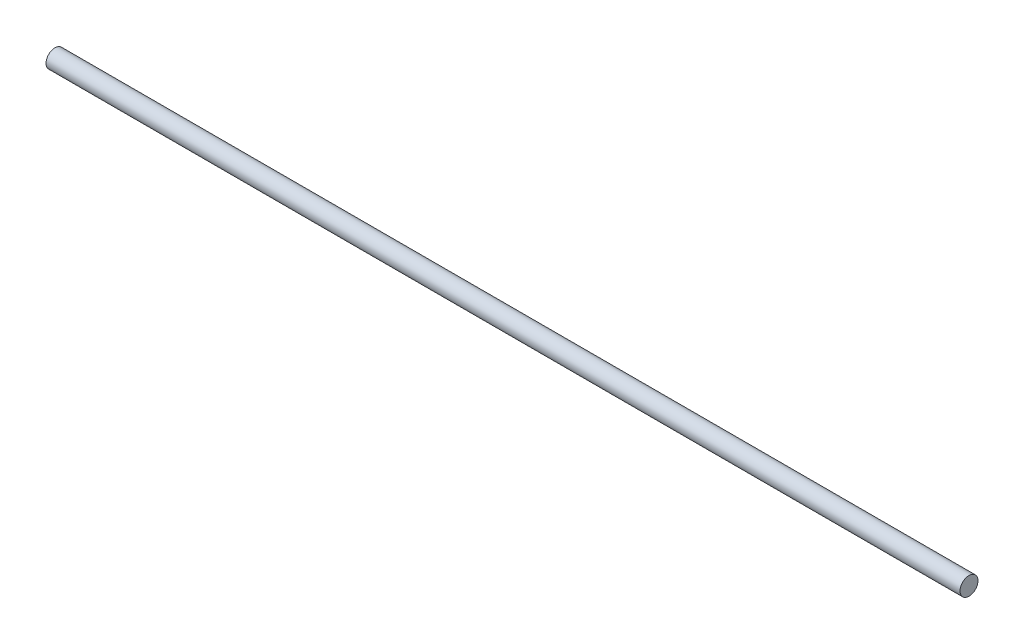
ISO-10303-21;
HEADER;
FILE_DESCRIPTION(('STEP AP214'),'2;1');
FILE_NAME('part.step','',(''),(''),'','','');
FILE_SCHEMA(('AUTOMOTIVE_DESIGN { 1 0 10303 214 1 1 1 1 }'));
ENDSEC;
DATA;
#1=APPLICATION_CONTEXT('core data for automotive mechanical design processes');
#2=APPLICATION_PROTOCOL_DEFINITION('international standard','automotive_design',2000,#1);
#3=PRODUCT_CONTEXT('',#1,'mechanical');
#4=PRODUCT('Part','Part','',(#3));
#5=PRODUCT_RELATED_PRODUCT_CATEGORY('part','',(#4));
#6=PRODUCT_DEFINITION_FORMATION('','',#4);
#7=PRODUCT_DEFINITION_CONTEXT('part definition',#1,'design');
#8=PRODUCT_DEFINITION('design','',#6,#7);
#9=PRODUCT_DEFINITION_SHAPE('','',#8);
#10=(LENGTH_UNIT() NAMED_UNIT(*) SI_UNIT(.MILLI.,.METRE.));
#11=(NAMED_UNIT(*) PLANE_ANGLE_UNIT() SI_UNIT($,.RADIAN.));
#12=(NAMED_UNIT(*) SI_UNIT($,.STERADIAN.) SOLID_ANGLE_UNIT());
#13=UNCERTAINTY_MEASURE_WITH_UNIT(LENGTH_MEASURE(1.E-05),#10,'distance_accuracy_value','');
#14=(GEOMETRIC_REPRESENTATION_CONTEXT(3) GLOBAL_UNCERTAINTY_ASSIGNED_CONTEXT((#13)) GLOBAL_UNIT_ASSIGNED_CONTEXT((#10,
#11,#12)) REPRESENTATION_CONTEXT('',''));
#15=CARTESIAN_POINT('',(0.,0.,0.));
#16=DIRECTION('',(0.,0.,1.));
#17=DIRECTION('',(1.,0.,0.));
#18=AXIS2_PLACEMENT_3D('',#15,#16,#17);
#19=CARTESIAN_POINT('',(304.8,0.,0.));
#20=DIRECTION('',(-1.,0.,0.));
#21=DIRECTION('',(0.,0.,1.));
#22=AXIS2_PLACEMENT_3D('',#19,#20,#21);
#23=CYLINDRICAL_SURFACE('',#22,6.);
#24=CARTESIAN_POINT('',(304.8,0.,0.));
#25=DIRECTION('',(1.,0.,0.));
#26=DIRECTION('',(0.,0.,-1.));
#27=AXIS2_PLACEMENT_3D('',#24,#25,#26);
#28=CIRCLE('',#27,6.);
#29=CARTESIAN_POINT('',(304.8,0.,6.));
#30=VERTEX_POINT('',#29);
#31=EDGE_CURVE('E10',#30,#30,#28,.T.);
#32=CARTESIAN_POINT('',(-304.8,0.,0.));
#33=DIRECTION('',(1.,0.,0.));
#34=DIRECTION('',(0.,0.,-1.));
#35=AXIS2_PLACEMENT_3D('',#32,#33,#34);
#36=CIRCLE('',#35,6.);
#37=CARTESIAN_POINT('',(-304.8,0.,6.));
#38=VERTEX_POINT('',#37);
#39=EDGE_CURVE('E34',#38,#38,#36,.T.);
#40=CARTESIAN_POINT('',(304.8,0.,6.));
#41=CARTESIAN_POINT('',(298.45,0.,6.));
#42=CARTESIAN_POINT('',(292.1,0.,6.));
#43=CARTESIAN_POINT('',(279.4,0.,6.));
#44=CARTESIAN_POINT('',(273.05,0.,6.));
#45=CARTESIAN_POINT('',(260.35,0.,6.));
#46=CARTESIAN_POINT('',(254.,0.,6.));
#47=CARTESIAN_POINT('',(241.3,0.,6.));
#48=CARTESIAN_POINT('',(234.95,0.,6.));
#49=CARTESIAN_POINT('',(222.25,0.,6.));
#50=CARTESIAN_POINT('',(215.9,0.,6.));
#51=CARTESIAN_POINT('',(203.2,0.,6.));
#52=CARTESIAN_POINT('',(196.85,0.,6.));
#53=CARTESIAN_POINT('',(184.15,0.,6.));
#54=CARTESIAN_POINT('',(177.8,0.,6.));
#55=CARTESIAN_POINT('',(165.1,0.,6.));
#56=CARTESIAN_POINT('',(158.75,0.,6.));
#57=CARTESIAN_POINT('',(146.05,0.,6.));
#58=CARTESIAN_POINT('',(139.7,0.,6.));
#59=CARTESIAN_POINT('',(127.,0.,6.));
#60=CARTESIAN_POINT('',(120.65,0.,6.));
#61=CARTESIAN_POINT('',(107.95,0.,6.));
#62=CARTESIAN_POINT('',(101.6,0.,6.));
#63=CARTESIAN_POINT('',(88.9,0.,6.));
#64=CARTESIAN_POINT('',(82.55,0.,6.));
#65=CARTESIAN_POINT('',(69.85,0.,6.));
#66=CARTESIAN_POINT('',(63.5,0.,6.));
#67=CARTESIAN_POINT('',(50.8,0.,6.));
#68=CARTESIAN_POINT('',(44.45,0.,6.));
#69=CARTESIAN_POINT('',(31.75,0.,6.));
#70=CARTESIAN_POINT('',(25.4,0.,6.));
#71=CARTESIAN_POINT('',(12.7,0.,6.));
#72=CARTESIAN_POINT('',(6.34999999999995,0.,6.));
#73=CARTESIAN_POINT('',(-6.35000000000006,0.,6.));
#74=CARTESIAN_POINT('',(-12.7000000000001,0.,6.));
#75=CARTESIAN_POINT('',(-25.4000000000001,0.,6.));
#76=CARTESIAN_POINT('',(-31.7500000000001,0.,6.));
#77=CARTESIAN_POINT('',(-44.4500000000001,0.,6.));
#78=CARTESIAN_POINT('',(-50.8000000000001,0.,6.));
#79=CARTESIAN_POINT('',(-63.5000000000001,0.,6.));
#80=CARTESIAN_POINT('',(-69.8500000000001,0.,6.));
#81=CARTESIAN_POINT('',(-82.5500000000001,0.,6.));
#82=CARTESIAN_POINT('',(-88.9000000000001,0.,6.));
#83=CARTESIAN_POINT('',(-101.6,0.,6.));
#84=CARTESIAN_POINT('',(-107.95,0.,6.));
#85=CARTESIAN_POINT('',(-120.65,0.,6.));
#86=CARTESIAN_POINT('',(-127.,0.,6.));
#87=CARTESIAN_POINT('',(-139.7,0.,6.));
#88=CARTESIAN_POINT('',(-146.05,0.,6.));
#89=CARTESIAN_POINT('',(-158.75,0.,6.));
#90=CARTESIAN_POINT('',(-165.1,0.,6.));
#91=CARTESIAN_POINT('',(-177.8,0.,6.));
#92=CARTESIAN_POINT('',(-184.15,0.,6.));
#93=CARTESIAN_POINT('',(-196.85,0.,6.));
#94=CARTESIAN_POINT('',(-203.2,0.,6.));
#95=CARTESIAN_POINT('',(-215.9,0.,6.));
#96=CARTESIAN_POINT('',(-222.25,0.,6.));
#97=CARTESIAN_POINT('',(-234.95,0.,6.));
#98=CARTESIAN_POINT('',(-241.3,0.,6.));
#99=CARTESIAN_POINT('',(-254.,0.,6.));
#100=CARTESIAN_POINT('',(-260.35,0.,6.));
#101=CARTESIAN_POINT('',(-273.05,0.,6.));
#102=CARTESIAN_POINT('',(-279.4,0.,6.));
#103=CARTESIAN_POINT('',(-292.1,0.,6.));
#104=CARTESIAN_POINT('',(-298.45,0.,6.));
#105=CARTESIAN_POINT('',(-304.8,0.,6.));
#106=B_SPLINE_CURVE_WITH_KNOTS('',3,(#40,#41,#42,#43,#44,#45,#46,#47,#48,#49,#50,#51,#52,#53,
#54,#55,#56,#57,#58,#59,#60,#61,#62,#63,#64,#65,#66,#67,#68,#69,#70,#71,#72,#73,#74,#75,#76,#77,
#78,#79,#80,#81,#82,#83,#84,#85,#86,#87,#88,#89,#90,#91,#92,#93,#94,#95,#96,#97,#98,#99,#100,
#101,#102,#103,#104,#105),.UNSPECIFIED.,.F.,.F.,(4,2,2,2,2,2,2,2,2,2,2,2,2,2,2,2,2,2,2,2,2,2,2,
2,2,2,2,2,2,2,2,2,4),(0.,19.05,38.1,57.15,76.2,95.25,114.3,133.35,152.4,171.45,190.5,209.55,
228.6,247.65,266.7,285.75,304.8,323.85,342.9,361.95,381.,400.05,419.1,438.15,457.2,476.25,495.3,
514.35,533.4,552.45,571.5,590.55,609.6),.UNSPECIFIED.);
#107=EDGE_CURVE('BSEAM31',#30,#38,#106,.T.);
#108=ORIENTED_EDGE('',*,*,#31,.F.);
#109=ORIENTED_EDGE('',*,*,#39,.T.);
#110=ORIENTED_EDGE('',*,*,#107,.T.);
#111=ORIENTED_EDGE('',*,*,#107,.F.);
#112=EDGE_LOOP('',(#108,#110,#109,#111));
#113=FACE_BOUND('',#112,.T.);
#114=ADVANCED_FACE('F31',(#113),#23,.T.);
#115=CARTESIAN_POINT('',(304.8,0.,0.));
#116=DIRECTION('',(1.,0.,0.));
#117=DIRECTION('',(0.,0.,-1.));
#118=AXIS2_PLACEMENT_3D('',#115,#116,#117);
#119=PLANE('',#118);
#120=ORIENTED_EDGE('',*,*,#31,.T.);
#121=EDGE_LOOP('',(#120));
#122=FACE_BOUND('',#121,.T.);
#123=ADVANCED_FACE('F46',(#122),#119,.T.);
#124=CARTESIAN_POINT('',(-304.8,0.,0.));
#125=DIRECTION('',(1.,0.,0.));
#126=DIRECTION('',(0.,0.,-1.));
#127=AXIS2_PLACEMENT_3D('',#124,#125,#126);
#128=PLANE('',#127);
#129=ORIENTED_EDGE('',*,*,#39,.F.);
#130=EDGE_LOOP('',(#129));
#131=FACE_BOUND('',#130,.T.);
#132=ADVANCED_FACE('F44',(#131),#128,.F.);
#133=CLOSED_SHELL('',(#114,#123,#132));
#134=MANIFOLD_SOLID_BREP('B2',#133);
#135=ADVANCED_BREP_SHAPE_REPRESENTATION('',(#18,#134),#14);
#136=SHAPE_DEFINITION_REPRESENTATION(#9,#135);
ENDSEC;
END-ISO-10303-21;
